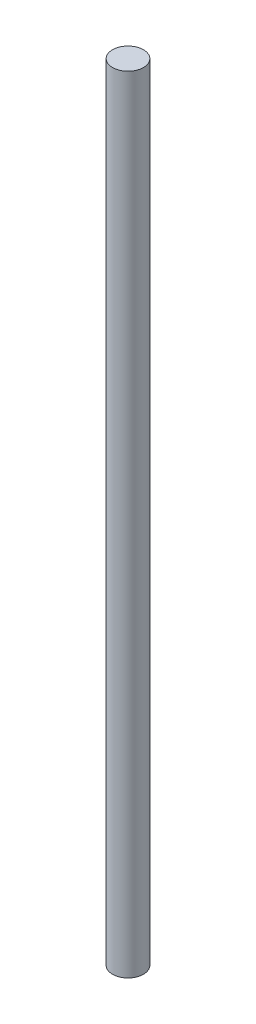
ISO-10303-21;
HEADER;
FILE_DESCRIPTION(('STEP AP214'),'2;1');
FILE_NAME('part.step','',(''),(''),'','','');
FILE_SCHEMA(('AUTOMOTIVE_DESIGN { 1 0 10303 214 1 1 1 1 }'));
ENDSEC;
DATA;
#1=APPLICATION_CONTEXT('core data for automotive mechanical design processes');
#2=APPLICATION_PROTOCOL_DEFINITION('international standard','automotive_design',2000,#1);
#3=PRODUCT_CONTEXT('',#1,'mechanical');
#4=PRODUCT('Part','Part','',(#3));
#5=PRODUCT_RELATED_PRODUCT_CATEGORY('part','',(#4));
#6=PRODUCT_DEFINITION_FORMATION('','',#4);
#7=PRODUCT_DEFINITION_CONTEXT('part definition',#1,'design');
#8=PRODUCT_DEFINITION('design','',#6,#7);
#9=PRODUCT_DEFINITION_SHAPE('','',#8);
#10=(LENGTH_UNIT() NAMED_UNIT(*) SI_UNIT(.MILLI.,.METRE.));
#11=(NAMED_UNIT(*) PLANE_ANGLE_UNIT() SI_UNIT($,.RADIAN.));
#12=(NAMED_UNIT(*) SI_UNIT($,.STERADIAN.) SOLID_ANGLE_UNIT());
#13=UNCERTAINTY_MEASURE_WITH_UNIT(LENGTH_MEASURE(1.E-05),#10,'distance_accuracy_value','');
#14=(GEOMETRIC_REPRESENTATION_CONTEXT(3) GLOBAL_UNCERTAINTY_ASSIGNED_CONTEXT((#13)) GLOBAL_UNIT_ASSIGNED_CONTEXT((#10,
#11,#12)) REPRESENTATION_CONTEXT('',''));
#15=CARTESIAN_POINT('',(0.,0.,0.));
#16=DIRECTION('',(0.,0.,1.));
#17=DIRECTION('',(1.,0.,0.));
#18=AXIS2_PLACEMENT_3D('',#15,#16,#17);
#19=CARTESIAN_POINT('',(0.,254.,0.));
#20=DIRECTION('',(0.,-1.,0.));
#21=DIRECTION('',(0.,0.,-1.));
#22=AXIS2_PLACEMENT_3D('',#19,#20,#21);
#23=CYLINDRICAL_SURFACE('',#22,5.);
#24=CARTESIAN_POINT('',(0.,254.,0.));
#25=DIRECTION('',(0.,1.,0.));
#26=DIRECTION('',(0.,0.,1.));
#27=AXIS2_PLACEMENT_3D('',#24,#25,#26);
#28=CIRCLE('',#27,5.);
#29=CARTESIAN_POINT('',(0.,254.,5.));
#30=VERTEX_POINT('',#29);
#31=EDGE_CURVE('E10',#30,#30,#28,.T.);
#32=ORIENTED_EDGE('',*,*,#31,.F.);
#33=EDGE_LOOP('',(#32));
#34=FACE_BOUND('',#33,.T.);
#35=CARTESIAN_POINT('',(0.,0.,0.));
#36=DIRECTION('',(0.,1.,0.));
#37=DIRECTION('',(0.,0.,1.));
#38=AXIS2_PLACEMENT_3D('',#35,#36,#37);
#39=CIRCLE('',#38,5.);
#40=CARTESIAN_POINT('',(0.,0.,5.));
#41=VERTEX_POINT('',#40);
#42=EDGE_CURVE('E34',#41,#41,#39,.T.);
#43=ORIENTED_EDGE('',*,*,#42,.T.);
#44=EDGE_LOOP('',(#43));
#45=FACE_BOUND('',#44,.T.);
#46=ADVANCED_FACE('F31',(#34,#45),#23,.T.);
#47=CARTESIAN_POINT('',(0.,254.,0.));
#48=DIRECTION('',(0.,1.,0.));
#49=DIRECTION('',(0.,0.,1.));
#50=AXIS2_PLACEMENT_3D('',#47,#48,#49);
#51=PLANE('',#50);
#52=ORIENTED_EDGE('',*,*,#31,.T.);
#53=EDGE_LOOP('',(#52));
#54=FACE_BOUND('',#53,.T.);
#55=ADVANCED_FACE('F46',(#54),#51,.T.);
#56=CARTESIAN_POINT('',(0.,0.,0.));
#57=DIRECTION('',(0.,1.,0.));
#58=DIRECTION('',(0.,0.,1.));
#59=AXIS2_PLACEMENT_3D('',#56,#57,#58);
#60=PLANE('',#59);
#61=ORIENTED_EDGE('',*,*,#42,.F.);
#62=EDGE_LOOP('',(#61));
#63=FACE_BOUND('',#62,.T.);
#64=ADVANCED_FACE('F44',(#63),#60,.F.);
#65=CLOSED_SHELL('',(#46,#55,#64));
#66=MANIFOLD_SOLID_BREP('B2',#65);
#67=ADVANCED_BREP_SHAPE_REPRESENTATION('',(#18,#66),#14);
#68=SHAPE_DEFINITION_REPRESENTATION(#9,#67);
ENDSEC;
END-ISO-10303-21;
